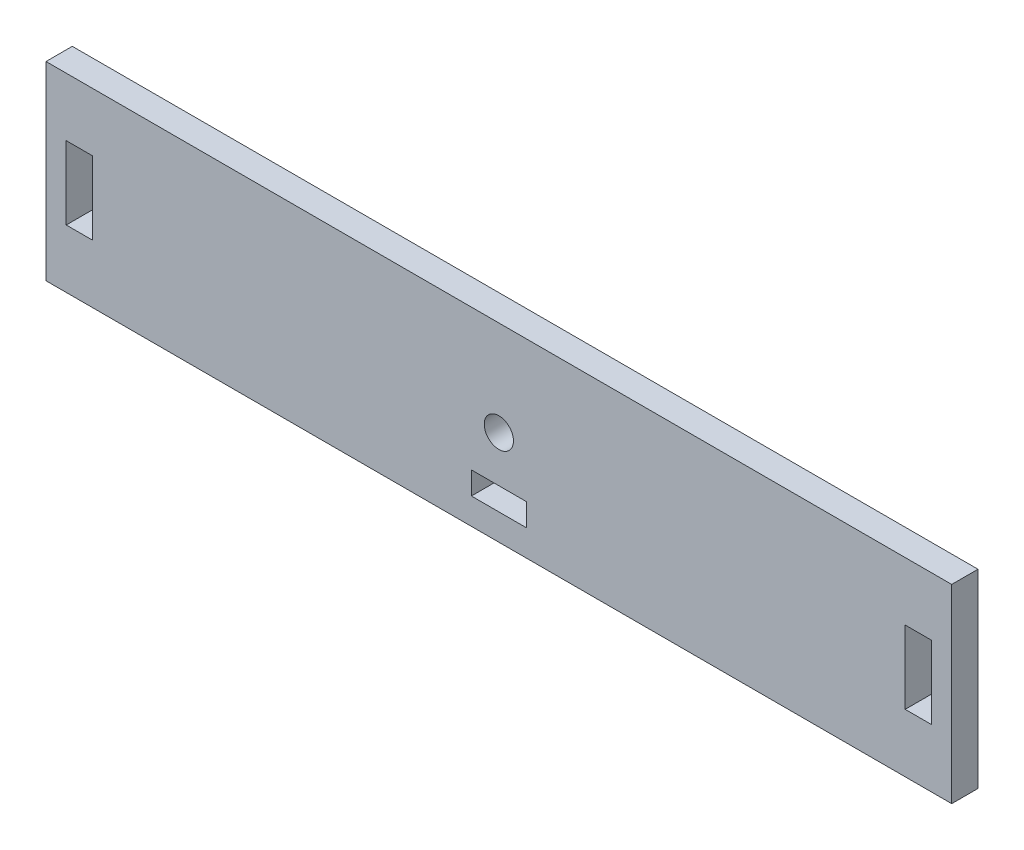
ISO-10303-21;
HEADER;
FILE_DESCRIPTION(('STEP AP214'),'2;1');
FILE_NAME('part.step','',(''),(''),'','','');
FILE_SCHEMA(('AUTOMOTIVE_DESIGN { 1 0 10303 214 1 1 1 1 }'));
ENDSEC;
DATA;
#1=APPLICATION_CONTEXT('core data for automotive mechanical design processes');
#2=APPLICATION_PROTOCOL_DEFINITION('international standard','automotive_design',2000,#1);
#3=PRODUCT_CONTEXT('',#1,'mechanical');
#4=PRODUCT('Part','Part','',(#3));
#5=PRODUCT_RELATED_PRODUCT_CATEGORY('part','',(#4));
#6=PRODUCT_DEFINITION_FORMATION('','',#4);
#7=PRODUCT_DEFINITION_CONTEXT('part definition',#1,'design');
#8=PRODUCT_DEFINITION('design','',#6,#7);
#9=PRODUCT_DEFINITION_SHAPE('','',#8);
#10=(LENGTH_UNIT() NAMED_UNIT(*) SI_UNIT(.MILLI.,.METRE.));
#11=(NAMED_UNIT(*) PLANE_ANGLE_UNIT() SI_UNIT($,.RADIAN.));
#12=(NAMED_UNIT(*) SI_UNIT($,.STERADIAN.) SOLID_ANGLE_UNIT());
#13=UNCERTAINTY_MEASURE_WITH_UNIT(LENGTH_MEASURE(1.E-05),#10,'distance_accuracy_value','');
#14=(GEOMETRIC_REPRESENTATION_CONTEXT(3) GLOBAL_UNCERTAINTY_ASSIGNED_CONTEXT((#13)) GLOBAL_UNIT_ASSIGNED_CONTEXT((#10,
#11,#12)) REPRESENTATION_CONTEXT('',''));
#15=CARTESIAN_POINT('',(0.,0.,0.));
#16=DIRECTION('',(0.,0.,1.));
#17=DIRECTION('',(1.,0.,0.));
#18=AXIS2_PLACEMENT_3D('',#15,#16,#17);
#19=CARTESIAN_POINT('',(0.,0.,18.));
#20=DIRECTION('',(0.,0.,1.));
#21=DIRECTION('',(1.,0.,0.));
#22=AXIS2_PLACEMENT_3D('',#19,#20,#21);
#23=PLANE('',#22);
#24=DIRECTION('',(0.,-1.,0.));
#25=VECTOR('',#24,1.);
#26=CARTESIAN_POINT('',(0.,0.,18.));
#27=LINE('',#26,#25);
#28=CARTESIAN_POINT('',(0.,0.,18.));
#29=VERTEX_POINT('',#28);
#30=CARTESIAN_POINT('',(0.,-130.,18.));
#31=VERTEX_POINT('',#30);
#32=EDGE_CURVE('E250',#29,#31,#27,.T.);
#33=ORIENTED_EDGE('',*,*,#32,.T.);
#34=DIRECTION('',(1.,0.,0.));
#35=VECTOR('',#34,1.);
#36=CARTESIAN_POINT('',(0.,-130.,18.));
#37=LINE('',#36,#35);
#38=CARTESIAN_POINT('',(620.,-130.,18.));
#39=VERTEX_POINT('',#38);
#40=EDGE_CURVE('E253',#31,#39,#37,.T.);
#41=ORIENTED_EDGE('',*,*,#40,.T.);
#42=DIRECTION('',(0.,1.,0.));
#43=VECTOR('',#42,1.);
#44=CARTESIAN_POINT('',(620.,0.,18.));
#45=LINE('',#44,#43);
#46=CARTESIAN_POINT('',(620.,0.,18.));
#47=VERTEX_POINT('',#46);
#48=EDGE_CURVE('E256',#39,#47,#45,.T.);
#49=ORIENTED_EDGE('',*,*,#48,.T.);
#50=DIRECTION('',(-1.,0.,0.));
#51=VECTOR('',#50,1.);
#52=CARTESIAN_POINT('',(0.,0.,18.));
#53=LINE('',#52,#51);
#54=EDGE_CURVE('E258',#47,#29,#53,.T.);
#55=ORIENTED_EDGE('',*,*,#54,.T.);
#56=EDGE_LOOP('',(#33,#41,#49,#55));
#57=FACE_BOUND('',#56,.T.);
#58=CARTESIAN_POINT('',(310.,-65.,18.));
#59=DIRECTION('',(0.,0.,1.));
#60=DIRECTION('',(1.,0.,0.));
#61=AXIS2_PLACEMENT_3D('',#58,#59,#60);
#62=CIRCLE('',#61,10.);
#63=CARTESIAN_POINT('',(320.,-65.,18.));
#64=VERTEX_POINT('',#63);
#65=EDGE_CURVE('E244',#64,#64,#62,.T.);
#66=ORIENTED_EDGE('',*,*,#65,.F.);
#67=EDGE_LOOP('',(#66));
#68=FACE_BOUND('',#67,.T.);
#69=DIRECTION('',(-1.,0.,0.));
#70=VECTOR('',#69,1.);
#71=CARTESIAN_POINT('',(291.192209516875,-96.5004513880421,18.));
#72=LINE('',#71,#70);
#73=CARTESIAN_POINT('',(328.807790483125,-96.5004513880421,18.));
#74=VERTEX_POINT('',#73);
#75=CARTESIAN_POINT('',(291.192209516875,-96.5004513880421,18.));
#76=VERTEX_POINT('',#75);
#77=EDGE_CURVE('E215',#74,#76,#72,.T.);
#78=ORIENTED_EDGE('',*,*,#77,.F.);
#79=DIRECTION('',(0.,1.,0.));
#80=VECTOR('',#79,1.);
#81=CARTESIAN_POINT('',(328.807790483125,-96.5004513880421,18.));
#82=LINE('',#81,#80);
#83=CARTESIAN_POINT('',(328.807790483125,-112.,18.));
#84=VERTEX_POINT('',#83);
#85=EDGE_CURVE('E213',#84,#74,#82,.T.);
#86=ORIENTED_EDGE('',*,*,#85,.F.);
#87=DIRECTION('',(1.,0.,0.));
#88=VECTOR('',#87,1.);
#89=CARTESIAN_POINT('',(291.192209516875,-112.,18.));
#90=LINE('',#89,#88);
#91=CARTESIAN_POINT('',(291.192209516875,-112.,18.));
#92=VERTEX_POINT('',#91);
#93=EDGE_CURVE('E221',#92,#84,#90,.T.);
#94=ORIENTED_EDGE('',*,*,#93,.F.);
#95=DIRECTION('',(0.,-1.,0.));
#96=VECTOR('',#95,1.);
#97=CARTESIAN_POINT('',(291.192209516875,-96.5004513880421,18.));
#98=LINE('',#97,#96);
#99=EDGE_CURVE('E218',#76,#92,#98,.T.);
#100=ORIENTED_EDGE('',*,*,#99,.F.);
#101=EDGE_LOOP('',(#78,#86,#94,#100));
#102=FACE_BOUND('',#101,.T.);
#103=DIRECTION('',(-1.,0.,0.));
#104=VECTOR('',#103,1.);
#105=CARTESIAN_POINT('',(588.143725827646,-40.0000000000002,18.));
#106=LINE('',#105,#104);
#107=CARTESIAN_POINT('',(606.143725827646,-40.0000000000002,18.));
#108=VERTEX_POINT('',#107);
#109=CARTESIAN_POINT('',(588.143725827646,-40.0000000000002,18.));
#110=VERTEX_POINT('',#109);
#111=EDGE_CURVE('E184',#108,#110,#106,.T.);
#112=ORIENTED_EDGE('',*,*,#111,.F.);
#113=DIRECTION('',(0.,1.,0.));
#114=VECTOR('',#113,1.);
#115=CARTESIAN_POINT('',(606.143725827646,-40.0000000000002,18.));
#116=LINE('',#115,#114);
#117=CARTESIAN_POINT('',(606.143725827646,-90.0000000000002,18.));
#118=VERTEX_POINT('',#117);
#119=EDGE_CURVE('E182',#118,#108,#116,.T.);
#120=ORIENTED_EDGE('',*,*,#119,.F.);
#121=DIRECTION('',(1.,0.,0.));
#122=VECTOR('',#121,1.);
#123=CARTESIAN_POINT('',(588.143725827646,-90.0000000000002,18.));
#124=LINE('',#123,#122);
#125=CARTESIAN_POINT('',(588.143725827646,-90.0000000000002,18.));
#126=VERTEX_POINT('',#125);
#127=EDGE_CURVE('E190',#126,#118,#124,.T.);
#128=ORIENTED_EDGE('',*,*,#127,.F.);
#129=DIRECTION('',(0.,-1.,0.));
#130=VECTOR('',#129,1.);
#131=CARTESIAN_POINT('',(588.143725827646,-40.0000000000002,18.));
#132=LINE('',#131,#130);
#133=EDGE_CURVE('E187',#110,#126,#132,.T.);
#134=ORIENTED_EDGE('',*,*,#133,.F.);
#135=EDGE_LOOP('',(#112,#120,#128,#134));
#136=FACE_BOUND('',#135,.T.);
#137=DIRECTION('',(-1.,0.,0.));
#138=VECTOR('',#137,1.);
#139=CARTESIAN_POINT('',(31.8562741723537,-40.0000000000002,18.));
#140=LINE('',#139,#138);
#141=CARTESIAN_POINT('',(31.8562741723537,-40.0000000000002,18.));
#142=VERTEX_POINT('',#141);
#143=CARTESIAN_POINT('',(13.8562741723537,-40.0000000000002,18.));
#144=VERTEX_POINT('',#143);
#145=EDGE_CURVE('E154',#142,#144,#140,.T.);
#146=ORIENTED_EDGE('',*,*,#145,.F.);
#147=DIRECTION('',(0.,1.,0.));
#148=VECTOR('',#147,1.);
#149=CARTESIAN_POINT('',(31.8562741723537,-40.0000000000002,18.));
#150=LINE('',#149,#148);
#151=CARTESIAN_POINT('',(31.8562741723537,-90.0000000000002,18.));
#152=VERTEX_POINT('',#151);
#153=EDGE_CURVE('E146',#152,#142,#150,.T.);
#154=ORIENTED_EDGE('',*,*,#153,.F.);
#155=DIRECTION('',(1.,0.,0.));
#156=VECTOR('',#155,1.);
#157=CARTESIAN_POINT('',(31.8562741723537,-90.0000000000002,18.));
#158=LINE('',#157,#156);
#159=CARTESIAN_POINT('',(13.8562741723537,-90.0000000000002,18.));
#160=VERTEX_POINT('',#159);
#161=EDGE_CURVE('E168',#160,#152,#158,.T.);
#162=ORIENTED_EDGE('',*,*,#161,.F.);
#163=DIRECTION('',(0.,-1.,0.));
#164=VECTOR('',#163,1.);
#165=CARTESIAN_POINT('',(13.8562741723537,-40.0000000000002,18.));
#166=LINE('',#165,#164);
#167=EDGE_CURVE('E166',#144,#160,#166,.T.);
#168=ORIENTED_EDGE('',*,*,#167,.F.);
#169=EDGE_LOOP('',(#146,#154,#162,#168));
#170=FACE_BOUND('',#169,.T.);
#171=ADVANCED_FACE('F33',(#57,#68,#102,#136,#170),#23,.T.);
#172=CARTESIAN_POINT('',(0.,0.,0.));
#173=DIRECTION('',(0.,0.,1.));
#174=DIRECTION('',(1.,0.,0.));
#175=AXIS2_PLACEMENT_3D('',#172,#173,#174);
#176=PLANE('',#175);
#177=DIRECTION('',(0.,1.,0.));
#178=VECTOR('',#177,1.);
#179=CARTESIAN_POINT('',(606.143725827646,-40.0000000000002,0.));
#180=LINE('',#179,#178);
#181=CARTESIAN_POINT('',(606.143725827646,-90.0000000000002,0.));
#182=VERTEX_POINT('',#181);
#183=CARTESIAN_POINT('',(606.143725827646,-40.0000000000002,0.));
#184=VERTEX_POINT('',#183);
#185=EDGE_CURVE('E162',#182,#184,#180,.T.);
#186=ORIENTED_EDGE('',*,*,#185,.T.);
#187=DIRECTION('',(-1.,0.,0.));
#188=VECTOR('',#187,1.);
#189=CARTESIAN_POINT('',(588.143725827646,-40.0000000000002,0.));
#190=LINE('',#189,#188);
#191=CARTESIAN_POINT('',(588.143725827646,-40.0000000000002,0.));
#192=VERTEX_POINT('',#191);
#193=EDGE_CURVE('E195',#184,#192,#190,.T.);
#194=ORIENTED_EDGE('',*,*,#193,.T.);
#195=DIRECTION('',(0.,-1.,0.));
#196=VECTOR('',#195,1.);
#197=CARTESIAN_POINT('',(588.143725827646,-40.0000000000002,0.));
#198=LINE('',#197,#196);
#199=CARTESIAN_POINT('',(588.143725827646,-90.0000000000002,0.));
#200=VERTEX_POINT('',#199);
#201=EDGE_CURVE('E198',#192,#200,#198,.T.);
#202=ORIENTED_EDGE('',*,*,#201,.T.);
#203=DIRECTION('',(1.,0.,0.));
#204=VECTOR('',#203,1.);
#205=CARTESIAN_POINT('',(588.143725827646,-90.0000000000002,0.));
#206=LINE('',#205,#204);
#207=EDGE_CURVE('E185',#200,#182,#206,.T.);
#208=ORIENTED_EDGE('',*,*,#207,.T.);
#209=EDGE_LOOP('',(#186,#194,#202,#208));
#210=FACE_BOUND('',#209,.T.);
#211=CARTESIAN_POINT('',(310.,-65.,0.));
#212=DIRECTION('',(0.,0.,1.));
#213=DIRECTION('',(1.,0.,0.));
#214=AXIS2_PLACEMENT_3D('',#211,#212,#213);
#215=CIRCLE('',#214,10.);
#216=CARTESIAN_POINT('',(320.,-65.,0.));
#217=VERTEX_POINT('',#216);
#218=EDGE_CURVE('E243',#217,#217,#215,.T.);
#219=ORIENTED_EDGE('',*,*,#218,.T.);
#220=EDGE_LOOP('',(#219));
#221=FACE_BOUND('',#220,.T.);
#222=DIRECTION('',(0.,-1.,0.));
#223=VECTOR('',#222,1.);
#224=CARTESIAN_POINT('',(0.,0.,0.));
#225=LINE('',#224,#223);
#226=CARTESIAN_POINT('',(0.,0.,0.));
#227=VERTEX_POINT('',#226);
#228=CARTESIAN_POINT('',(0.,-130.,0.));
#229=VERTEX_POINT('',#228);
#230=EDGE_CURVE('E247',#227,#229,#225,.T.);
#231=ORIENTED_EDGE('',*,*,#230,.F.);
#232=DIRECTION('',(-1.,0.,0.));
#233=VECTOR('',#232,1.);
#234=CARTESIAN_POINT('',(0.,0.,0.));
#235=LINE('',#234,#233);
#236=CARTESIAN_POINT('',(620.,0.,0.));
#237=VERTEX_POINT('',#236);
#238=EDGE_CURVE('E254',#237,#227,#235,.T.);
#239=ORIENTED_EDGE('',*,*,#238,.F.);
#240=DIRECTION('',(0.,1.,0.));
#241=VECTOR('',#240,1.);
#242=CARTESIAN_POINT('',(620.,0.,0.));
#243=LINE('',#242,#241);
#244=CARTESIAN_POINT('',(620.,-130.,0.));
#245=VERTEX_POINT('',#244);
#246=EDGE_CURVE('E265',#245,#237,#243,.T.);
#247=ORIENTED_EDGE('',*,*,#246,.F.);
#248=DIRECTION('',(1.,0.,0.));
#249=VECTOR('',#248,1.);
#250=CARTESIAN_POINT('',(0.,-130.,0.));
#251=LINE('',#250,#249);
#252=EDGE_CURVE('E263',#229,#245,#251,.T.);
#253=ORIENTED_EDGE('',*,*,#252,.F.);
#254=EDGE_LOOP('',(#231,#239,#247,#253));
#255=FACE_BOUND('',#254,.T.);
#256=DIRECTION('',(0.,1.,0.));
#257=VECTOR('',#256,1.);
#258=CARTESIAN_POINT('',(328.807790483125,-96.5004513880421,0.));
#259=LINE('',#258,#257);
#260=CARTESIAN_POINT('',(328.807790483125,-112.,0.));
#261=VERTEX_POINT('',#260);
#262=CARTESIAN_POINT('',(328.807790483125,-96.5004513880421,0.));
#263=VERTEX_POINT('',#262);
#264=EDGE_CURVE('E212',#261,#263,#259,.T.);
#265=ORIENTED_EDGE('',*,*,#264,.T.);
#266=DIRECTION('',(-1.,0.,0.));
#267=VECTOR('',#266,1.);
#268=CARTESIAN_POINT('',(291.192209516875,-96.5004513880421,0.));
#269=LINE('',#268,#267);
#270=CARTESIAN_POINT('',(291.192209516875,-96.5004513880421,0.));
#271=VERTEX_POINT('',#270);
#272=EDGE_CURVE('E226',#263,#271,#269,.T.);
#273=ORIENTED_EDGE('',*,*,#272,.T.);
#274=DIRECTION('',(0.,-1.,0.));
#275=VECTOR('',#274,1.);
#276=CARTESIAN_POINT('',(291.192209516875,-96.5004513880421,0.));
#277=LINE('',#276,#275);
#278=CARTESIAN_POINT('',(291.192209516875,-112.,0.));
#279=VERTEX_POINT('',#278);
#280=EDGE_CURVE('E229',#271,#279,#277,.T.);
#281=ORIENTED_EDGE('',*,*,#280,.T.);
#282=DIRECTION('',(1.,0.,0.));
#283=VECTOR('',#282,1.);
#284=CARTESIAN_POINT('',(291.192209516875,-112.,0.));
#285=LINE('',#284,#283);
#286=EDGE_CURVE('E216',#279,#261,#285,.T.);
#287=ORIENTED_EDGE('',*,*,#286,.T.);
#288=EDGE_LOOP('',(#265,#273,#281,#287));
#289=FACE_BOUND('',#288,.T.);
#290=DIRECTION('',(0.,1.,0.));
#291=VECTOR('',#290,1.);
#292=CARTESIAN_POINT('',(31.8562741723537,-40.0000000000002,0.));
#293=LINE('',#292,#291);
#294=CARTESIAN_POINT('',(31.8562741723537,-90.0000000000002,0.));
#295=VERTEX_POINT('',#294);
#296=CARTESIAN_POINT('',(31.8562741723537,-40.0000000000002,0.));
#297=VERTEX_POINT('',#296);
#298=EDGE_CURVE('E56',#295,#297,#293,.T.);
#299=ORIENTED_EDGE('',*,*,#298,.T.);
#300=DIRECTION('',(-1.,0.,0.));
#301=VECTOR('',#300,1.);
#302=CARTESIAN_POINT('',(31.8562741723537,-40.0000000000002,0.));
#303=LINE('',#302,#301);
#304=CARTESIAN_POINT('',(13.8562741723537,-40.0000000000002,0.));
#305=VERTEX_POINT('',#304);
#306=EDGE_CURVE('E161',#297,#305,#303,.T.);
#307=ORIENTED_EDGE('',*,*,#306,.T.);
#308=DIRECTION('',(0.,-1.,0.));
#309=VECTOR('',#308,1.);
#310=CARTESIAN_POINT('',(13.8562741723537,-40.0000000000002,0.));
#311=LINE('',#310,#309);
#312=CARTESIAN_POINT('',(13.8562741723537,-90.0000000000002,0.));
#313=VERTEX_POINT('',#312);
#314=EDGE_CURVE('E174',#305,#313,#311,.T.);
#315=ORIENTED_EDGE('',*,*,#314,.T.);
#316=DIRECTION('',(1.,0.,0.));
#317=VECTOR('',#316,1.);
#318=CARTESIAN_POINT('',(31.8562741723537,-90.0000000000002,0.));
#319=LINE('',#318,#317);
#320=EDGE_CURVE('E155',#313,#295,#319,.T.);
#321=ORIENTED_EDGE('',*,*,#320,.T.);
#322=EDGE_LOOP('',(#299,#307,#315,#321));
#323=FACE_BOUND('',#322,.T.);
#324=ADVANCED_FACE('F283',(#210,#221,#255,#289,#323),#176,.F.);
#325=CARTESIAN_POINT('',(0.,0.,18.));
#326=DIRECTION('',(1.,0.,0.));
#327=DIRECTION('',(0.,1.,0.));
#328=AXIS2_PLACEMENT_3D('',#325,#326,#327);
#329=PLANE('',#328);
#330=ORIENTED_EDGE('',*,*,#230,.T.);
#331=DIRECTION('',(0.,0.,-1.));
#332=VECTOR('',#331,1.);
#333=CARTESIAN_POINT('',(0.,-130.,18.));
#334=LINE('',#333,#332);
#335=EDGE_CURVE('E11',#31,#229,#334,.T.);
#336=ORIENTED_EDGE('',*,*,#335,.F.);
#337=ORIENTED_EDGE('',*,*,#32,.F.);
#338=DIRECTION('',(0.,0.,-1.));
#339=VECTOR('',#338,1.);
#340=CARTESIAN_POINT('',(0.,0.,18.));
#341=LINE('',#340,#339);
#342=EDGE_CURVE('E260',#29,#227,#341,.T.);
#343=ORIENTED_EDGE('',*,*,#342,.T.);
#344=EDGE_LOOP('',(#330,#336,#337,#343));
#345=FACE_BOUND('',#344,.T.);
#346=ADVANCED_FACE('F35',(#345),#329,.F.);
#347=CARTESIAN_POINT('',(0.,-130.,18.));
#348=DIRECTION('',(0.,1.,0.));
#349=DIRECTION('',(0.,0.,1.));
#350=AXIS2_PLACEMENT_3D('',#347,#348,#349);
#351=PLANE('',#350);
#352=ORIENTED_EDGE('',*,*,#252,.T.);
#353=DIRECTION('',(0.,0.,-1.));
#354=VECTOR('',#353,1.);
#355=CARTESIAN_POINT('',(620.,-130.,18.));
#356=LINE('',#355,#354);
#357=EDGE_CURVE('E41',#39,#245,#356,.T.);
#358=ORIENTED_EDGE('',*,*,#357,.F.);
#359=ORIENTED_EDGE('',*,*,#40,.F.);
#360=ORIENTED_EDGE('',*,*,#335,.T.);
#361=EDGE_LOOP('',(#352,#358,#359,#360));
#362=FACE_BOUND('',#361,.T.);
#363=ADVANCED_FACE('F294',(#362),#351,.F.);
#364=CARTESIAN_POINT('',(620.,0.,18.));
#365=DIRECTION('',(-1.,0.,0.));
#366=DIRECTION('',(0.,0.,1.));
#367=AXIS2_PLACEMENT_3D('',#364,#365,#366);
#368=PLANE('',#367);
#369=ORIENTED_EDGE('',*,*,#246,.T.);
#370=DIRECTION('',(0.,0.,-1.));
#371=VECTOR('',#370,1.);
#372=CARTESIAN_POINT('',(620.,0.,18.));
#373=LINE('',#372,#371);
#374=EDGE_CURVE('E270',#47,#237,#373,.T.);
#375=ORIENTED_EDGE('',*,*,#374,.F.);
#376=ORIENTED_EDGE('',*,*,#48,.F.);
#377=ORIENTED_EDGE('',*,*,#357,.T.);
#378=EDGE_LOOP('',(#369,#375,#376,#377));
#379=FACE_BOUND('',#378,.T.);
#380=ADVANCED_FACE('F277',(#379),#368,.F.);
#381=CARTESIAN_POINT('',(0.,0.,18.));
#382=DIRECTION('',(0.,-1.,0.));
#383=DIRECTION('',(0.,0.,-1.));
#384=AXIS2_PLACEMENT_3D('',#381,#382,#383);
#385=PLANE('',#384);
#386=ORIENTED_EDGE('',*,*,#238,.T.);
#387=ORIENTED_EDGE('',*,*,#342,.F.);
#388=ORIENTED_EDGE('',*,*,#54,.F.);
#389=ORIENTED_EDGE('',*,*,#374,.T.);
#390=EDGE_LOOP('',(#386,#387,#388,#389));
#391=FACE_BOUND('',#390,.T.);
#392=ADVANCED_FACE('F287',(#391),#385,.F.);
#393=CARTESIAN_POINT('',(310.,-65.,18.));
#394=DIRECTION('',(0.,0.,-1.));
#395=DIRECTION('',(-1.,0.,0.));
#396=AXIS2_PLACEMENT_3D('',#393,#394,#395);
#397=CYLINDRICAL_SURFACE('',#396,10.);
#398=ORIENTED_EDGE('',*,*,#65,.T.);
#399=EDGE_LOOP('',(#398));
#400=FACE_BOUND('',#399,.T.);
#401=ORIENTED_EDGE('',*,*,#218,.F.);
#402=EDGE_LOOP('',(#401));
#403=FACE_BOUND('',#402,.T.);
#404=ADVANCED_FACE('F309',(#400,#403),#397,.F.);
#405=CARTESIAN_POINT('',(328.807790483125,-96.5004513880421,18.));
#406=DIRECTION('',(-1.,0.,0.));
#407=DIRECTION('',(0.,0.,1.));
#408=AXIS2_PLACEMENT_3D('',#405,#406,#407);
#409=PLANE('',#408);
#410=ORIENTED_EDGE('',*,*,#264,.F.);
#411=DIRECTION('',(0.,0.,-1.));
#412=VECTOR('',#411,1.);
#413=CARTESIAN_POINT('',(328.807790483125,-112.,18.));
#414=LINE('',#413,#412);
#415=EDGE_CURVE('E223',#84,#261,#414,.T.);
#416=ORIENTED_EDGE('',*,*,#415,.F.);
#417=ORIENTED_EDGE('',*,*,#85,.T.);
#418=DIRECTION('',(0.,0.,-1.));
#419=VECTOR('',#418,1.);
#420=CARTESIAN_POINT('',(328.807790483125,-96.5004513880421,18.));
#421=LINE('',#420,#419);
#422=EDGE_CURVE('E240',#74,#263,#421,.T.);
#423=ORIENTED_EDGE('',*,*,#422,.T.);
#424=EDGE_LOOP('',(#410,#416,#417,#423));
#425=FACE_BOUND('',#424,.T.);
#426=ADVANCED_FACE('F316',(#425),#409,.T.);
#427=CARTESIAN_POINT('',(291.192209516875,-96.5004513880421,18.));
#428=DIRECTION('',(0.,-1.,0.));
#429=DIRECTION('',(0.,0.,-1.));
#430=AXIS2_PLACEMENT_3D('',#427,#428,#429);
#431=PLANE('',#430);
#432=ORIENTED_EDGE('',*,*,#272,.F.);
#433=ORIENTED_EDGE('',*,*,#422,.F.);
#434=ORIENTED_EDGE('',*,*,#77,.T.);
#435=DIRECTION('',(0.,0.,-1.));
#436=VECTOR('',#435,1.);
#437=CARTESIAN_POINT('',(291.192209516875,-96.5004513880421,18.));
#438=LINE('',#437,#436);
#439=EDGE_CURVE('E238',#76,#271,#438,.T.);
#440=ORIENTED_EDGE('',*,*,#439,.T.);
#441=EDGE_LOOP('',(#432,#433,#434,#440));
#442=FACE_BOUND('',#441,.T.);
#443=ADVANCED_FACE('F321',(#442),#431,.T.);
#444=CARTESIAN_POINT('',(291.192209516875,-96.5004513880421,18.));
#445=DIRECTION('',(1.,0.,0.));
#446=DIRECTION('',(0.,0.,-1.));
#447=AXIS2_PLACEMENT_3D('',#444,#445,#446);
#448=PLANE('',#447);
#449=ORIENTED_EDGE('',*,*,#280,.F.);
#450=ORIENTED_EDGE('',*,*,#439,.F.);
#451=ORIENTED_EDGE('',*,*,#99,.T.);
#452=DIRECTION('',(0.,0.,-1.));
#453=VECTOR('',#452,1.);
#454=CARTESIAN_POINT('',(291.192209516875,-112.,18.));
#455=LINE('',#454,#453);
#456=EDGE_CURVE('E236',#92,#279,#455,.T.);
#457=ORIENTED_EDGE('',*,*,#456,.T.);
#458=EDGE_LOOP('',(#449,#450,#451,#457));
#459=FACE_BOUND('',#458,.T.);
#460=ADVANCED_FACE('F366',(#459),#448,.T.);
#461=CARTESIAN_POINT('',(291.192209516875,-112.,18.));
#462=DIRECTION('',(0.,1.,0.));
#463=DIRECTION('',(0.,0.,1.));
#464=AXIS2_PLACEMENT_3D('',#461,#462,#463);
#465=PLANE('',#464);
#466=ORIENTED_EDGE('',*,*,#286,.F.);
#467=ORIENTED_EDGE('',*,*,#456,.F.);
#468=ORIENTED_EDGE('',*,*,#93,.T.);
#469=ORIENTED_EDGE('',*,*,#415,.T.);
#470=EDGE_LOOP('',(#466,#467,#468,#469));
#471=FACE_BOUND('',#470,.T.);
#472=ADVANCED_FACE('F363',(#471),#465,.T.);
#473=CARTESIAN_POINT('',(606.143725827646,-40.0000000000002,18.));
#474=DIRECTION('',(-1.,0.,0.));
#475=DIRECTION('',(0.,0.,1.));
#476=AXIS2_PLACEMENT_3D('',#473,#474,#475);
#477=PLANE('',#476);
#478=ORIENTED_EDGE('',*,*,#185,.F.);
#479=DIRECTION('',(0.,0.,-1.));
#480=VECTOR('',#479,1.);
#481=CARTESIAN_POINT('',(606.143725827646,-90.0000000000002,18.));
#482=LINE('',#481,#480);
#483=EDGE_CURVE('E192',#118,#182,#482,.T.);
#484=ORIENTED_EDGE('',*,*,#483,.F.);
#485=ORIENTED_EDGE('',*,*,#119,.T.);
#486=DIRECTION('',(0.,0.,-1.));
#487=VECTOR('',#486,1.);
#488=CARTESIAN_POINT('',(606.143725827646,-40.0000000000002,18.));
#489=LINE('',#488,#487);
#490=EDGE_CURVE('E209',#108,#184,#489,.T.);
#491=ORIENTED_EDGE('',*,*,#490,.T.);
#492=EDGE_LOOP('',(#478,#484,#485,#491));
#493=FACE_BOUND('',#492,.T.);
#494=ADVANCED_FACE('F345',(#493),#477,.T.);
#495=CARTESIAN_POINT('',(588.143725827646,-40.0000000000002,18.));
#496=DIRECTION('',(0.,-1.,0.));
#497=DIRECTION('',(0.,0.,-1.));
#498=AXIS2_PLACEMENT_3D('',#495,#496,#497);
#499=PLANE('',#498);
#500=ORIENTED_EDGE('',*,*,#193,.F.);
#501=ORIENTED_EDGE('',*,*,#490,.F.);
#502=ORIENTED_EDGE('',*,*,#111,.T.);
#503=DIRECTION('',(0.,0.,-1.));
#504=VECTOR('',#503,1.);
#505=CARTESIAN_POINT('',(588.143725827646,-40.0000000000002,18.));
#506=LINE('',#505,#504);
#507=EDGE_CURVE('E207',#110,#192,#506,.T.);
#508=ORIENTED_EDGE('',*,*,#507,.T.);
#509=EDGE_LOOP('',(#500,#501,#502,#508));
#510=FACE_BOUND('',#509,.T.);
#511=ADVANCED_FACE('F339',(#510),#499,.T.);
#512=CARTESIAN_POINT('',(588.143725827646,-40.0000000000002,18.));
#513=DIRECTION('',(1.,0.,0.));
#514=DIRECTION('',(0.,0.,-1.));
#515=AXIS2_PLACEMENT_3D('',#512,#513,#514);
#516=PLANE('',#515);
#517=ORIENTED_EDGE('',*,*,#201,.F.);
#518=ORIENTED_EDGE('',*,*,#507,.F.);
#519=ORIENTED_EDGE('',*,*,#133,.T.);
#520=DIRECTION('',(0.,0.,-1.));
#521=VECTOR('',#520,1.);
#522=CARTESIAN_POINT('',(588.143725827646,-90.0000000000002,18.));
#523=LINE('',#522,#521);
#524=EDGE_CURVE('E205',#126,#200,#523,.T.);
#525=ORIENTED_EDGE('',*,*,#524,.T.);
#526=EDGE_LOOP('',(#517,#518,#519,#525));
#527=FACE_BOUND('',#526,.T.);
#528=ADVANCED_FACE('F342',(#527),#516,.T.);
#529=CARTESIAN_POINT('',(588.143725827646,-90.0000000000002,18.));
#530=DIRECTION('',(0.,1.,0.));
#531=DIRECTION('',(0.,0.,1.));
#532=AXIS2_PLACEMENT_3D('',#529,#530,#531);
#533=PLANE('',#532);
#534=ORIENTED_EDGE('',*,*,#207,.F.);
#535=ORIENTED_EDGE('',*,*,#524,.F.);
#536=ORIENTED_EDGE('',*,*,#127,.T.);
#537=ORIENTED_EDGE('',*,*,#483,.T.);
#538=EDGE_LOOP('',(#534,#535,#536,#537));
#539=FACE_BOUND('',#538,.T.);
#540=ADVANCED_FACE('F348',(#539),#533,.T.);
#541=CARTESIAN_POINT('',(31.8562741723537,-40.0000000000002,18.));
#542=DIRECTION('',(-1.,0.,0.));
#543=DIRECTION('',(0.,0.,1.));
#544=AXIS2_PLACEMENT_3D('',#541,#542,#543);
#545=PLANE('',#544);
#546=ORIENTED_EDGE('',*,*,#298,.F.);
#547=DIRECTION('',(0.,0.,-1.));
#548=VECTOR('',#547,1.);
#549=CARTESIAN_POINT('',(31.8562741723537,-90.0000000000002,18.));
#550=LINE('',#549,#548);
#551=EDGE_CURVE('E150',#152,#295,#550,.T.);
#552=ORIENTED_EDGE('',*,*,#551,.F.);
#553=ORIENTED_EDGE('',*,*,#153,.T.);
#554=DIRECTION('',(0.,0.,-1.));
#555=VECTOR('',#554,1.);
#556=CARTESIAN_POINT('',(31.8562741723537,-40.0000000000002,18.));
#557=LINE('',#556,#555);
#558=EDGE_CURVE('E149',#142,#297,#557,.T.);
#559=ORIENTED_EDGE('',*,*,#558,.T.);
#560=EDGE_LOOP('',(#546,#552,#553,#559));
#561=FACE_BOUND('',#560,.T.);
#562=ADVANCED_FACE('F148',(#561),#545,.T.);
#563=CARTESIAN_POINT('',(31.8562741723537,-40.0000000000002,18.));
#564=DIRECTION('',(0.,-1.,0.));
#565=DIRECTION('',(0.,0.,-1.));
#566=AXIS2_PLACEMENT_3D('',#563,#564,#565);
#567=PLANE('',#566);
#568=ORIENTED_EDGE('',*,*,#306,.F.);
#569=ORIENTED_EDGE('',*,*,#558,.F.);
#570=ORIENTED_EDGE('',*,*,#145,.T.);
#571=DIRECTION('',(0.,0.,-1.));
#572=VECTOR('',#571,1.);
#573=CARTESIAN_POINT('',(13.8562741723537,-40.0000000000002,18.));
#574=LINE('',#573,#572);
#575=EDGE_CURVE('E163',#144,#305,#574,.T.);
#576=ORIENTED_EDGE('',*,*,#575,.T.);
#577=EDGE_LOOP('',(#568,#569,#570,#576));
#578=FACE_BOUND('',#577,.T.);
#579=ADVANCED_FACE('F158',(#578),#567,.T.);
#580=CARTESIAN_POINT('',(13.8562741723537,-40.0000000000002,18.));
#581=DIRECTION('',(1.,0.,0.));
#582=DIRECTION('',(0.,0.,-1.));
#583=AXIS2_PLACEMENT_3D('',#580,#581,#582);
#584=PLANE('',#583);
#585=ORIENTED_EDGE('',*,*,#314,.F.);
#586=ORIENTED_EDGE('',*,*,#575,.F.);
#587=ORIENTED_EDGE('',*,*,#167,.T.);
#588=DIRECTION('',(0.,0.,-1.));
#589=VECTOR('',#588,1.);
#590=CARTESIAN_POINT('',(13.8562741723537,-90.0000000000002,18.));
#591=LINE('',#590,#589);
#592=EDGE_CURVE('E48',#160,#313,#591,.T.);
#593=ORIENTED_EDGE('',*,*,#592,.T.);
#594=EDGE_LOOP('',(#585,#586,#587,#593));
#595=FACE_BOUND('',#594,.T.);
#596=ADVANCED_FACE('F385',(#595),#584,.T.);
#597=CARTESIAN_POINT('',(31.8562741723537,-90.0000000000002,18.));
#598=DIRECTION('',(0.,1.,0.));
#599=DIRECTION('',(0.,0.,1.));
#600=AXIS2_PLACEMENT_3D('',#597,#598,#599);
#601=PLANE('',#600);
#602=ORIENTED_EDGE('',*,*,#320,.F.);
#603=ORIENTED_EDGE('',*,*,#592,.F.);
#604=ORIENTED_EDGE('',*,*,#161,.T.);
#605=ORIENTED_EDGE('',*,*,#551,.T.);
#606=EDGE_LOOP('',(#602,#603,#604,#605));
#607=FACE_BOUND('',#606,.T.);
#608=ADVANCED_FACE('F383',(#607),#601,.T.);
#609=CLOSED_SHELL('',(#171,#324,#346,#363,#380,#392,#404,#426,#443,#460,#472,#494,#511,#528,
#540,#562,#579,#596,#608));
#610=MANIFOLD_SOLID_BREP('B2',#609);
#611=ADVANCED_BREP_SHAPE_REPRESENTATION('',(#18,#610),#14);
#612=SHAPE_DEFINITION_REPRESENTATION(#9,#611);
ENDSEC;
END-ISO-10303-21;
